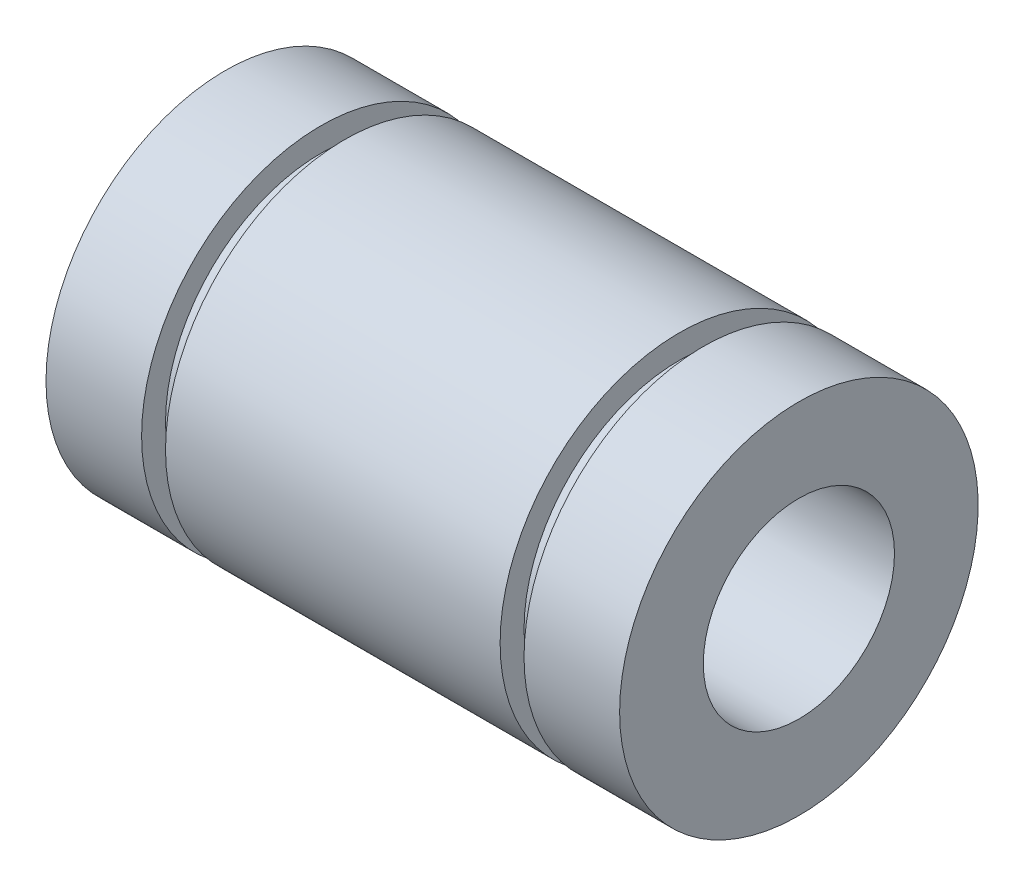
ISO-10303-21;
HEADER;
FILE_DESCRIPTION(('STEP AP214'),'2;1');
FILE_NAME('part.step','',(''),(''),'','','');
FILE_SCHEMA(('AUTOMOTIVE_DESIGN { 1 0 10303 214 1 1 1 1 }'));
ENDSEC;
DATA;
#1=APPLICATION_CONTEXT('core data for automotive mechanical design processes');
#2=APPLICATION_PROTOCOL_DEFINITION('international standard','automotive_design',2000,#1);
#3=PRODUCT_CONTEXT('',#1,'mechanical');
#4=PRODUCT('Part','Part','',(#3));
#5=PRODUCT_RELATED_PRODUCT_CATEGORY('part','',(#4));
#6=PRODUCT_DEFINITION_FORMATION('','',#4);
#7=PRODUCT_DEFINITION_CONTEXT('part definition',#1,'design');
#8=PRODUCT_DEFINITION('design','',#6,#7);
#9=PRODUCT_DEFINITION_SHAPE('','',#8);
#10=(LENGTH_UNIT() NAMED_UNIT(*) SI_UNIT(.MILLI.,.METRE.));
#11=(NAMED_UNIT(*) PLANE_ANGLE_UNIT() SI_UNIT($,.RADIAN.));
#12=(NAMED_UNIT(*) SI_UNIT($,.STERADIAN.) SOLID_ANGLE_UNIT());
#13=UNCERTAINTY_MEASURE_WITH_UNIT(LENGTH_MEASURE(1.E-05),#10,'distance_accuracy_value','');
#14=(GEOMETRIC_REPRESENTATION_CONTEXT(3) GLOBAL_UNCERTAINTY_ASSIGNED_CONTEXT((#13)) GLOBAL_UNIT_ASSIGNED_CONTEXT((#10,
#11,#12)) REPRESENTATION_CONTEXT('',''));
#15=CARTESIAN_POINT('',(0.,0.,0.));
#16=DIRECTION('',(0.,0.,1.));
#17=DIRECTION('',(1.,0.,0.));
#18=AXIS2_PLACEMENT_3D('',#15,#16,#17);
#19=CARTESIAN_POINT('',(0.,0.,0.));
#20=DIRECTION('',(-1.,0.,0.));
#21=DIRECTION('',(0.,0.,1.));
#22=AXIS2_PLACEMENT_3D('',#19,#20,#21);
#23=CYLINDRICAL_SURFACE('',#22,7.5);
#24=CARTESIAN_POINT('',(0.,0.,0.));
#25=DIRECTION('',(-1.,0.,0.));
#26=DIRECTION('',(0.,0.,1.));
#27=AXIS2_PLACEMENT_3D('',#24,#25,#26);
#28=CIRCLE('',#27,7.5);
#29=CARTESIAN_POINT('',(0.,0.,7.5));
#30=VERTEX_POINT('',#29);
#31=EDGE_CURVE('E70',#30,#30,#28,.T.);
#32=ORIENTED_EDGE('',*,*,#31,.F.);
#33=EDGE_LOOP('',(#32));
#34=FACE_BOUND('',#33,.T.);
#35=CARTESIAN_POINT('',(4.,0.,0.));
#36=DIRECTION('',(-1.,0.,0.));
#37=DIRECTION('',(0.,0.,1.));
#38=AXIS2_PLACEMENT_3D('',#35,#36,#37);
#39=CIRCLE('',#38,7.5);
#40=CARTESIAN_POINT('',(4.,0.,7.5));
#41=VERTEX_POINT('',#40);
#42=EDGE_CURVE('E10',#41,#41,#39,.T.);
#43=ORIENTED_EDGE('',*,*,#42,.T.);
#44=EDGE_LOOP('',(#43));
#45=FACE_BOUND('',#44,.T.);
#46=ADVANCED_FACE('F30',(#34,#45),#23,.T.);
#47=CARTESIAN_POINT('',(4.,7.5,0.));
#48=DIRECTION('',(-1.,0.,0.));
#49=DIRECTION('',(0.,0.,1.));
#50=AXIS2_PLACEMENT_3D('',#47,#48,#49);
#51=PLANE('',#50);
#52=ORIENTED_EDGE('',*,*,#42,.F.);
#53=EDGE_LOOP('',(#52));
#54=FACE_BOUND('',#53,.T.);
#55=CARTESIAN_POINT('',(4.,0.,0.));
#56=DIRECTION('',(-1.,0.,0.));
#57=DIRECTION('',(0.,0.,1.));
#58=AXIS2_PLACEMENT_3D('',#55,#56,#57);
#59=CIRCLE('',#58,6.5);
#60=CARTESIAN_POINT('',(4.,0.,6.5));
#61=VERTEX_POINT('',#60);
#62=EDGE_CURVE('E36',#61,#61,#59,.T.);
#63=ORIENTED_EDGE('',*,*,#62,.T.);
#64=EDGE_LOOP('',(#63));
#65=FACE_BOUND('',#64,.T.);
#66=ADVANCED_FACE('F77',(#54,#65),#51,.F.);
#67=CARTESIAN_POINT('',(0.,0.,0.));
#68=DIRECTION('',(-1.,0.,0.));
#69=DIRECTION('',(0.,0.,1.));
#70=AXIS2_PLACEMENT_3D('',#67,#68,#69);
#71=CYLINDRICAL_SURFACE('',#70,6.5);
#72=ORIENTED_EDGE('',*,*,#62,.F.);
#73=EDGE_LOOP('',(#72));
#74=FACE_BOUND('',#73,.T.);
#75=CARTESIAN_POINT('',(5.,0.,0.));
#76=DIRECTION('',(-1.,0.,0.));
#77=DIRECTION('',(0.,0.,1.));
#78=AXIS2_PLACEMENT_3D('',#75,#76,#77);
#79=CIRCLE('',#78,6.5);
#80=CARTESIAN_POINT('',(5.,0.,6.5));
#81=VERTEX_POINT('',#80);
#82=EDGE_CURVE('E40',#81,#81,#79,.T.);
#83=ORIENTED_EDGE('',*,*,#82,.T.);
#84=EDGE_LOOP('',(#83));
#85=FACE_BOUND('',#84,.T.);
#86=ADVANCED_FACE('F81',(#74,#85),#71,.T.);
#87=CARTESIAN_POINT('',(5.,6.5,0.));
#88=DIRECTION('',(1.,0.,0.));
#89=DIRECTION('',(0.,0.,-1.));
#90=AXIS2_PLACEMENT_3D('',#87,#88,#89);
#91=PLANE('',#90);
#92=ORIENTED_EDGE('',*,*,#82,.F.);
#93=EDGE_LOOP('',(#92));
#94=FACE_BOUND('',#93,.T.);
#95=CARTESIAN_POINT('',(5.,0.,0.));
#96=DIRECTION('',(-1.,0.,0.));
#97=DIRECTION('',(0.,0.,1.));
#98=AXIS2_PLACEMENT_3D('',#95,#96,#97);
#99=CIRCLE('',#98,7.5);
#100=CARTESIAN_POINT('',(5.,0.,7.5));
#101=VERTEX_POINT('',#100);
#102=EDGE_CURVE('E44',#101,#101,#99,.T.);
#103=ORIENTED_EDGE('',*,*,#102,.T.);
#104=EDGE_LOOP('',(#103));
#105=FACE_BOUND('',#104,.T.);
#106=ADVANCED_FACE('F86',(#94,#105),#91,.F.);
#107=CARTESIAN_POINT('',(0.,0.,0.));
#108=DIRECTION('',(-1.,0.,0.));
#109=DIRECTION('',(0.,0.,1.));
#110=AXIS2_PLACEMENT_3D('',#107,#108,#109);
#111=CYLINDRICAL_SURFACE('',#110,7.5);
#112=ORIENTED_EDGE('',*,*,#102,.F.);
#113=EDGE_LOOP('',(#112));
#114=FACE_BOUND('',#113,.T.);
#115=CARTESIAN_POINT('',(19.,0.,0.));
#116=DIRECTION('',(-1.,0.,0.));
#117=DIRECTION('',(0.,0.,1.));
#118=AXIS2_PLACEMENT_3D('',#115,#116,#117);
#119=CIRCLE('',#118,7.5);
#120=CARTESIAN_POINT('',(19.,0.,7.5));
#121=VERTEX_POINT('',#120);
#122=EDGE_CURVE('E49',#121,#121,#119,.T.);
#123=ORIENTED_EDGE('',*,*,#122,.T.);
#124=EDGE_LOOP('',(#123));
#125=FACE_BOUND('',#124,.T.);
#126=ADVANCED_FACE('F92',(#114,#125),#111,.T.);
#127=CARTESIAN_POINT('',(19.,7.5,0.));
#128=DIRECTION('',(-1.,0.,0.));
#129=DIRECTION('',(0.,0.,1.));
#130=AXIS2_PLACEMENT_3D('',#127,#128,#129);
#131=PLANE('',#130);
#132=ORIENTED_EDGE('',*,*,#122,.F.);
#133=EDGE_LOOP('',(#132));
#134=FACE_BOUND('',#133,.T.);
#135=CARTESIAN_POINT('',(19.,0.,0.));
#136=DIRECTION('',(-1.,0.,0.));
#137=DIRECTION('',(0.,0.,1.));
#138=AXIS2_PLACEMENT_3D('',#135,#136,#137);
#139=CIRCLE('',#138,6.5);
#140=CARTESIAN_POINT('',(19.,0.,6.5));
#141=VERTEX_POINT('',#140);
#142=EDGE_CURVE('E52',#141,#141,#139,.T.);
#143=ORIENTED_EDGE('',*,*,#142,.T.);
#144=EDGE_LOOP('',(#143));
#145=FACE_BOUND('',#144,.T.);
#146=ADVANCED_FACE('F96',(#134,#145),#131,.F.);
#147=CARTESIAN_POINT('',(0.,0.,0.));
#148=DIRECTION('',(-1.,0.,0.));
#149=DIRECTION('',(0.,0.,1.));
#150=AXIS2_PLACEMENT_3D('',#147,#148,#149);
#151=CYLINDRICAL_SURFACE('',#150,6.5);
#152=ORIENTED_EDGE('',*,*,#142,.F.);
#153=EDGE_LOOP('',(#152));
#154=FACE_BOUND('',#153,.T.);
#155=CARTESIAN_POINT('',(20.,0.,0.));
#156=DIRECTION('',(-1.,0.,0.));
#157=DIRECTION('',(0.,0.,1.));
#158=AXIS2_PLACEMENT_3D('',#155,#156,#157);
#159=CIRCLE('',#158,6.5);
#160=CARTESIAN_POINT('',(20.,0.,6.5));
#161=VERTEX_POINT('',#160);
#162=EDGE_CURVE('E55',#161,#161,#159,.T.);
#163=ORIENTED_EDGE('',*,*,#162,.T.);
#164=EDGE_LOOP('',(#163));
#165=FACE_BOUND('',#164,.T.);
#166=ADVANCED_FACE('F100',(#154,#165),#151,.T.);
#167=CARTESIAN_POINT('',(20.,6.5,0.));
#168=DIRECTION('',(1.,0.,0.));
#169=DIRECTION('',(0.,0.,-1.));
#170=AXIS2_PLACEMENT_3D('',#167,#168,#169);
#171=PLANE('',#170);
#172=ORIENTED_EDGE('',*,*,#162,.F.);
#173=EDGE_LOOP('',(#172));
#174=FACE_BOUND('',#173,.T.);
#175=CARTESIAN_POINT('',(20.,0.,0.));
#176=DIRECTION('',(-1.,0.,0.));
#177=DIRECTION('',(0.,0.,1.));
#178=AXIS2_PLACEMENT_3D('',#175,#176,#177);
#179=CIRCLE('',#178,7.5);
#180=CARTESIAN_POINT('',(20.,0.,7.5));
#181=VERTEX_POINT('',#180);
#182=EDGE_CURVE('E58',#181,#181,#179,.T.);
#183=ORIENTED_EDGE('',*,*,#182,.T.);
#184=EDGE_LOOP('',(#183));
#185=FACE_BOUND('',#184,.T.);
#186=ADVANCED_FACE('F104',(#174,#185),#171,.F.);
#187=CARTESIAN_POINT('',(0.,0.,0.));
#188=DIRECTION('',(-1.,0.,0.));
#189=DIRECTION('',(0.,0.,1.));
#190=AXIS2_PLACEMENT_3D('',#187,#188,#189);
#191=CYLINDRICAL_SURFACE('',#190,7.5);
#192=ORIENTED_EDGE('',*,*,#182,.F.);
#193=EDGE_LOOP('',(#192));
#194=FACE_BOUND('',#193,.T.);
#195=CARTESIAN_POINT('',(24.,0.,0.));
#196=DIRECTION('',(-1.,0.,0.));
#197=DIRECTION('',(0.,0.,1.));
#198=AXIS2_PLACEMENT_3D('',#195,#196,#197);
#199=CIRCLE('',#198,7.5);
#200=CARTESIAN_POINT('',(24.,0.,7.5));
#201=VERTEX_POINT('',#200);
#202=EDGE_CURVE('E61',#201,#201,#199,.T.);
#203=ORIENTED_EDGE('',*,*,#202,.T.);
#204=EDGE_LOOP('',(#203));
#205=FACE_BOUND('',#204,.T.);
#206=ADVANCED_FACE('F108',(#194,#205),#191,.T.);
#207=CARTESIAN_POINT('',(24.,7.5,0.));
#208=DIRECTION('',(-1.,0.,0.));
#209=DIRECTION('',(0.,0.,1.));
#210=AXIS2_PLACEMENT_3D('',#207,#208,#209);
#211=PLANE('',#210);
#212=ORIENTED_EDGE('',*,*,#202,.F.);
#213=EDGE_LOOP('',(#212));
#214=FACE_BOUND('',#213,.T.);
#215=CARTESIAN_POINT('',(24.,0.,0.));
#216=DIRECTION('',(-1.,0.,0.));
#217=DIRECTION('',(0.,0.,1.));
#218=AXIS2_PLACEMENT_3D('',#215,#216,#217);
#219=CIRCLE('',#218,4.);
#220=CARTESIAN_POINT('',(24.,0.,4.));
#221=VERTEX_POINT('',#220);
#222=EDGE_CURVE('E64',#221,#221,#219,.T.);
#223=ORIENTED_EDGE('',*,*,#222,.T.);
#224=EDGE_LOOP('',(#223));
#225=FACE_BOUND('',#224,.T.);
#226=ADVANCED_FACE('F112',(#214,#225),#211,.F.);
#227=CARTESIAN_POINT('',(0.,0.,0.));
#228=DIRECTION('',(-1.,0.,0.));
#229=DIRECTION('',(0.,0.,1.));
#230=AXIS2_PLACEMENT_3D('',#227,#228,#229);
#231=CYLINDRICAL_SURFACE('',#230,4.);
#232=ORIENTED_EDGE('',*,*,#222,.F.);
#233=EDGE_LOOP('',(#232));
#234=FACE_BOUND('',#233,.T.);
#235=CARTESIAN_POINT('',(0.,0.,0.));
#236=DIRECTION('',(-1.,0.,0.));
#237=DIRECTION('',(0.,0.,1.));
#238=AXIS2_PLACEMENT_3D('',#235,#236,#237);
#239=CIRCLE('',#238,4.);
#240=CARTESIAN_POINT('',(0.,0.,4.));
#241=VERTEX_POINT('',#240);
#242=EDGE_CURVE('E67',#241,#241,#239,.T.);
#243=ORIENTED_EDGE('',*,*,#242,.T.);
#244=EDGE_LOOP('',(#243));
#245=FACE_BOUND('',#244,.T.);
#246=ADVANCED_FACE('F116',(#234,#245),#231,.F.);
#247=CARTESIAN_POINT('',(0.,4.,0.));
#248=DIRECTION('',(1.,0.,0.));
#249=DIRECTION('',(0.,0.,-1.));
#250=AXIS2_PLACEMENT_3D('',#247,#248,#249);
#251=PLANE('',#250);
#252=ORIENTED_EDGE('',*,*,#242,.F.);
#253=EDGE_LOOP('',(#252));
#254=FACE_BOUND('',#253,.T.);
#255=ORIENTED_EDGE('',*,*,#31,.T.);
#256=EDGE_LOOP('',(#255));
#257=FACE_BOUND('',#256,.T.);
#258=ADVANCED_FACE('F74',(#254,#257),#251,.F.);
#259=CLOSED_SHELL('',(#46,#66,#86,#106,#126,#146,#166,#186,#206,#226,#246,#258));
#260=MANIFOLD_SOLID_BREP('B2',#259);
#261=ADVANCED_BREP_SHAPE_REPRESENTATION('',(#18,#260),#14);
#262=SHAPE_DEFINITION_REPRESENTATION(#9,#261);
ENDSEC;
END-ISO-10303-21;
